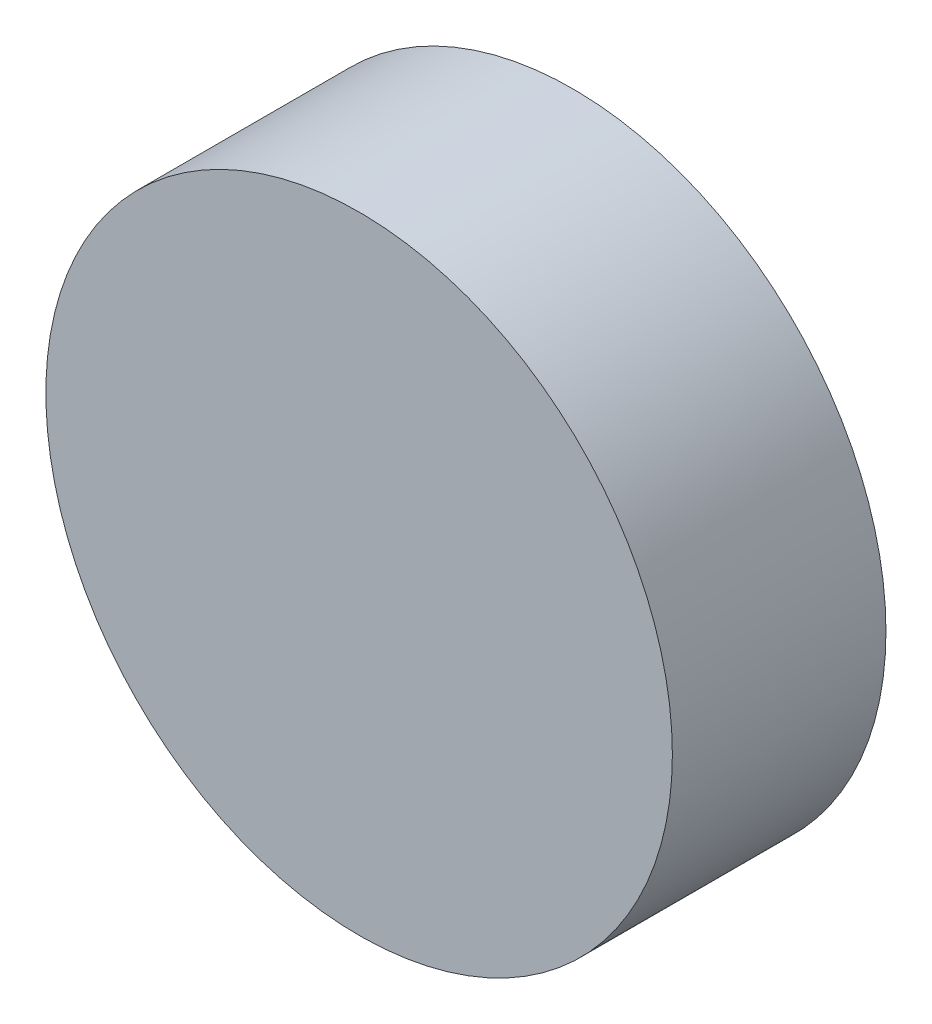
ISO-10303-21;
HEADER;
FILE_DESCRIPTION(('STEP AP214'),'2;1');
FILE_NAME('part.step','',(''),(''),'','','');
FILE_SCHEMA(('AUTOMOTIVE_DESIGN { 1 0 10303 214 1 1 1 1 }'));
ENDSEC;
DATA;
#1=APPLICATION_CONTEXT('core data for automotive mechanical design processes');
#2=APPLICATION_PROTOCOL_DEFINITION('international standard','automotive_design',2000,#1);
#3=PRODUCT_CONTEXT('',#1,'mechanical');
#4=PRODUCT('Part','Part','',(#3));
#5=PRODUCT_RELATED_PRODUCT_CATEGORY('part','',(#4));
#6=PRODUCT_DEFINITION_FORMATION('','',#4);
#7=PRODUCT_DEFINITION_CONTEXT('part definition',#1,'design');
#8=PRODUCT_DEFINITION('design','',#6,#7);
#9=PRODUCT_DEFINITION_SHAPE('','',#8);
#10=(LENGTH_UNIT() NAMED_UNIT(*) SI_UNIT(.MILLI.,.METRE.));
#11=(NAMED_UNIT(*) PLANE_ANGLE_UNIT() SI_UNIT($,.RADIAN.));
#12=(NAMED_UNIT(*) SI_UNIT($,.STERADIAN.) SOLID_ANGLE_UNIT());
#13=UNCERTAINTY_MEASURE_WITH_UNIT(LENGTH_MEASURE(1.E-05),#10,'distance_accuracy_value','');
#14=(GEOMETRIC_REPRESENTATION_CONTEXT(3) GLOBAL_UNCERTAINTY_ASSIGNED_CONTEXT((#13)) GLOBAL_UNIT_ASSIGNED_CONTEXT((#10,
#11,#12)) REPRESENTATION_CONTEXT('',''));
#15=CARTESIAN_POINT('',(0.,0.,0.));
#16=DIRECTION('',(0.,0.,1.));
#17=DIRECTION('',(1.,0.,0.));
#18=AXIS2_PLACEMENT_3D('',#15,#16,#17);
#19=CARTESIAN_POINT('',(0.,0.,15.));
#20=DIRECTION('',(0.,0.,-1.));
#21=DIRECTION('',(-1.,0.,0.));
#22=AXIS2_PLACEMENT_3D('',#19,#20,#21);
#23=CYLINDRICAL_SURFACE('',#22,22.);
#24=CARTESIAN_POINT('',(0.,0.,15.));
#25=DIRECTION('',(0.,0.,1.));
#26=DIRECTION('',(1.,0.,0.));
#27=AXIS2_PLACEMENT_3D('',#24,#25,#26);
#28=CIRCLE('',#27,22.);
#29=CARTESIAN_POINT('',(22.,0.,15.));
#30=VERTEX_POINT('',#29);
#31=EDGE_CURVE('E10',#30,#30,#28,.T.);
#32=ORIENTED_EDGE('',*,*,#31,.F.);
#33=EDGE_LOOP('',(#32));
#34=FACE_BOUND('',#33,.T.);
#35=CARTESIAN_POINT('',(0.,0.,0.));
#36=DIRECTION('',(0.,0.,1.));
#37=DIRECTION('',(1.,0.,0.));
#38=AXIS2_PLACEMENT_3D('',#35,#36,#37);
#39=CIRCLE('',#38,22.);
#40=CARTESIAN_POINT('',(22.,0.,0.));
#41=VERTEX_POINT('',#40);
#42=EDGE_CURVE('E34',#41,#41,#39,.T.);
#43=ORIENTED_EDGE('',*,*,#42,.T.);
#44=EDGE_LOOP('',(#43));
#45=FACE_BOUND('',#44,.T.);
#46=ADVANCED_FACE('F31',(#34,#45),#23,.T.);
#47=CARTESIAN_POINT('',(0.,0.,15.));
#48=DIRECTION('',(0.,0.,1.));
#49=DIRECTION('',(1.,0.,0.));
#50=AXIS2_PLACEMENT_3D('',#47,#48,#49);
#51=PLANE('',#50);
#52=ORIENTED_EDGE('',*,*,#31,.T.);
#53=EDGE_LOOP('',(#52));
#54=FACE_BOUND('',#53,.T.);
#55=ADVANCED_FACE('F79',(#54),#51,.T.);
#56=CARTESIAN_POINT('',(0.,0.,0.));
#57=DIRECTION('',(0.,0.,1.));
#58=DIRECTION('',(1.,0.,0.));
#59=AXIS2_PLACEMENT_3D('',#56,#57,#58);
#60=PLANE('',#59);
#61=CARTESIAN_POINT('',(0.,0.,0.));
#62=DIRECTION('',(0.,0.,-1.));
#63=DIRECTION('',(-1.,0.,0.));
#64=AXIS2_PLACEMENT_3D('',#61,#62,#63);
#65=CIRCLE('',#64,17.07577373129);
#66=CARTESIAN_POINT('',(-17.07577373129,0.,0.));
#67=VERTEX_POINT('',#66);
#68=EDGE_CURVE('E49',#67,#67,#65,.T.);
#69=ORIENTED_EDGE('',*,*,#68,.F.);
#70=EDGE_LOOP('',(#69));
#71=FACE_BOUND('',#70,.T.);
#72=ORIENTED_EDGE('',*,*,#42,.F.);
#73=EDGE_LOOP('',(#72));
#74=FACE_BOUND('',#73,.T.);
#75=ADVANCED_FACE('F73',(#71,#74),#60,.F.);
#76=CARTESIAN_POINT('',(0.,0.,8.));
#77=DIRECTION('',(0.,0.,-1.));
#78=DIRECTION('',(-1.,0.,0.));
#79=AXIS2_PLACEMENT_3D('',#76,#77,#78);
#80=CYLINDRICAL_SURFACE('',#79,17.07577373129);
#81=CARTESIAN_POINT('',(0.,0.,8.));
#82=DIRECTION('',(0.,0.,-1.));
#83=DIRECTION('',(-1.,0.,0.));
#84=AXIS2_PLACEMENT_3D('',#81,#82,#83);
#85=CIRCLE('',#84,17.07577373129);
#86=CARTESIAN_POINT('',(-17.07577373129,0.,8.));
#87=VERTEX_POINT('',#86);
#88=EDGE_CURVE('E46',#87,#87,#85,.T.);
#89=ORIENTED_EDGE('',*,*,#88,.F.);
#90=EDGE_LOOP('',(#89));
#91=FACE_BOUND('',#90,.T.);
#92=ORIENTED_EDGE('',*,*,#68,.T.);
#93=EDGE_LOOP('',(#92));
#94=FACE_BOUND('',#93,.T.);
#95=ADVANCED_FACE('F67',(#91,#94),#80,.F.);
#96=CARTESIAN_POINT('',(0.,0.,8.));
#97=DIRECTION('',(0.,0.,-1.));
#98=DIRECTION('',(-1.,0.,0.));
#99=AXIS2_PLACEMENT_3D('',#96,#97,#98);
#100=PLANE('',#99);
#101=CARTESIAN_POINT('',(0.,0.,8.));
#102=DIRECTION('',(0.,0.,-1.));
#103=DIRECTION('',(-1.,0.,0.));
#104=AXIS2_PLACEMENT_3D('',#101,#102,#103);
#105=CIRCLE('',#104,14.5930621641734);
#106=CARTESIAN_POINT('',(-14.5930621641734,0.,8.));
#107=VERTEX_POINT('',#106);
#108=EDGE_CURVE('E52',#107,#107,#105,.T.);
#109=ORIENTED_EDGE('',*,*,#108,.F.);
#110=EDGE_LOOP('',(#109));
#111=FACE_BOUND('',#110,.T.);
#112=ORIENTED_EDGE('',*,*,#88,.T.);
#113=EDGE_LOOP('',(#112));
#114=FACE_BOUND('',#113,.T.);
#115=ADVANCED_FACE('F64',(#111,#114),#100,.T.);
#116=CARTESIAN_POINT('',(0.,0.,8.));
#117=DIRECTION('',(0.,0.,-1.));
#118=DIRECTION('',(-1.,0.,0.));
#119=AXIS2_PLACEMENT_3D('',#116,#117,#118);
#120=CYLINDRICAL_SURFACE('',#119,14.5930621641734);
#121=ORIENTED_EDGE('',*,*,#108,.T.);
#122=EDGE_LOOP('',(#121));
#123=FACE_BOUND('',#122,.T.);
#124=CARTESIAN_POINT('',(0.,0.,0.));
#125=DIRECTION('',(0.,0.,-1.));
#126=DIRECTION('',(-1.,0.,0.));
#127=AXIS2_PLACEMENT_3D('',#124,#125,#126);
#128=CIRCLE('',#127,14.5930621641734);
#129=CARTESIAN_POINT('',(-14.5930621641734,0.,0.));
#130=VERTEX_POINT('',#129);
#131=EDGE_CURVE('E55',#130,#130,#128,.T.);
#132=ORIENTED_EDGE('',*,*,#131,.F.);
#133=EDGE_LOOP('',(#132));
#134=FACE_BOUND('',#133,.T.);
#135=ADVANCED_FACE('F61',(#123,#134),#120,.T.);
#136=CARTESIAN_POINT('',(0.,0.,5.));
#137=DIRECTION('',(0.,0.,-1.));
#138=DIRECTION('',(-1.,0.,0.));
#139=AXIS2_PLACEMENT_3D('',#136,#137,#138);
#140=PLANE('',#139);
#141=CARTESIAN_POINT('',(0.,0.,5.));
#142=DIRECTION('',(0.,0.,-1.));
#143=DIRECTION('',(-1.,0.,0.));
#144=AXIS2_PLACEMENT_3D('',#141,#142,#143);
#145=CIRCLE('',#144,10.);
#146=CARTESIAN_POINT('',(-10.,0.,5.));
#147=VERTEX_POINT('',#146);
#148=EDGE_CURVE('E41',#147,#147,#145,.T.);
#149=ORIENTED_EDGE('',*,*,#148,.T.);
#150=EDGE_LOOP('',(#149));
#151=FACE_BOUND('',#150,.T.);
#152=ADVANCED_FACE('F95',(#151),#140,.T.);
#153=CARTESIAN_POINT('',(0.,0.,5.));
#154=DIRECTION('',(0.,0.,-1.));
#155=DIRECTION('',(-1.,0.,0.));
#156=AXIS2_PLACEMENT_3D('',#153,#154,#155);
#157=CYLINDRICAL_SURFACE('',#156,10.);
#158=ORIENTED_EDGE('',*,*,#148,.F.);
#159=EDGE_LOOP('',(#158));
#160=FACE_BOUND('',#159,.T.);
#161=CARTESIAN_POINT('',(0.,0.,0.));
#162=DIRECTION('',(0.,0.,-1.));
#163=DIRECTION('',(-1.,0.,0.));
#164=AXIS2_PLACEMENT_3D('',#161,#162,#163);
#165=CIRCLE('',#164,10.);
#166=CARTESIAN_POINT('',(-10.,0.,0.));
#167=VERTEX_POINT('',#166);
#168=EDGE_CURVE('E43',#167,#167,#165,.T.);
#169=ORIENTED_EDGE('',*,*,#168,.T.);
#170=EDGE_LOOP('',(#169));
#171=FACE_BOUND('',#170,.T.);
#172=ADVANCED_FACE('F92',(#160,#171),#157,.F.);
#173=ORIENTED_EDGE('',*,*,#168,.F.);
#174=EDGE_LOOP('',(#173));
#175=FACE_BOUND('',#174,.T.);
#176=ORIENTED_EDGE('',*,*,#131,.T.);
#177=EDGE_LOOP('',(#176));
#178=FACE_BOUND('',#177,.T.);
#179=ADVANCED_FACE('F80',(#175,#178),#60,.F.);
#180=CLOSED_SHELL('',(#46,#55,#75,#95,#115,#135,#152,#172,#179));
#181=MANIFOLD_SOLID_BREP('B2',#180);
#182=ADVANCED_BREP_SHAPE_REPRESENTATION('',(#18,#181),#14);
#183=SHAPE_DEFINITION_REPRESENTATION(#9,#182);
ENDSEC;
END-ISO-10303-21;
